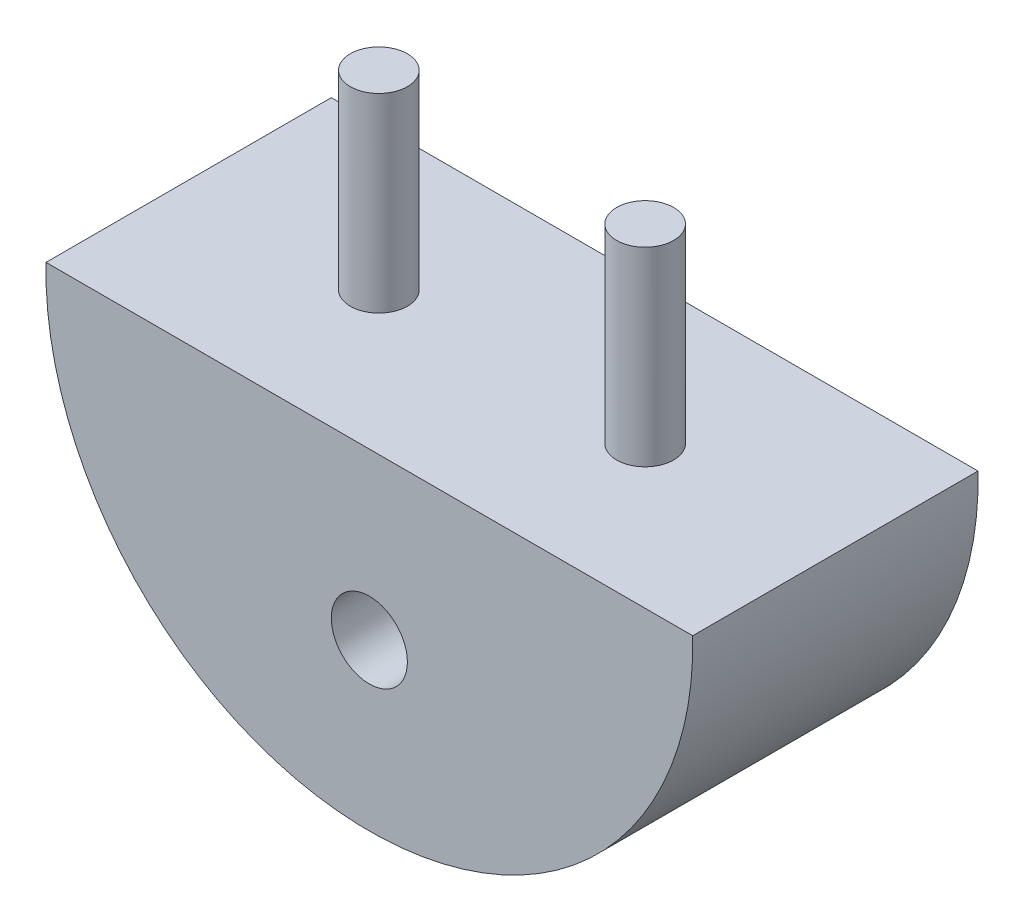
ISO-10303-21;
HEADER;
FILE_DESCRIPTION(('STEP AP214'),'2;1');
FILE_NAME('part.step','',(''),(''),'','','');
FILE_SCHEMA(('AUTOMOTIVE_DESIGN { 1 0 10303 214 1 1 1 1 }'));
ENDSEC;
DATA;
#1=APPLICATION_CONTEXT('core data for automotive mechanical design processes');
#2=APPLICATION_PROTOCOL_DEFINITION('international standard','automotive_design',2000,#1);
#3=PRODUCT_CONTEXT('',#1,'mechanical');
#4=PRODUCT('Part','Part','',(#3));
#5=PRODUCT_RELATED_PRODUCT_CATEGORY('part','',(#4));
#6=PRODUCT_DEFINITION_FORMATION('','',#4);
#7=PRODUCT_DEFINITION_CONTEXT('part definition',#1,'design');
#8=PRODUCT_DEFINITION('design','',#6,#7);
#9=PRODUCT_DEFINITION_SHAPE('','',#8);
#10=(LENGTH_UNIT() NAMED_UNIT(*) SI_UNIT(.MILLI.,.METRE.));
#11=(NAMED_UNIT(*) PLANE_ANGLE_UNIT() SI_UNIT($,.RADIAN.));
#12=(NAMED_UNIT(*) SI_UNIT($,.STERADIAN.) SOLID_ANGLE_UNIT());
#13=UNCERTAINTY_MEASURE_WITH_UNIT(LENGTH_MEASURE(1.E-05),#10,'distance_accuracy_value','');
#14=(GEOMETRIC_REPRESENTATION_CONTEXT(3) GLOBAL_UNCERTAINTY_ASSIGNED_CONTEXT((#13)) GLOBAL_UNIT_ASSIGNED_CONTEXT((#10,
#11,#12)) REPRESENTATION_CONTEXT('',''));
#15=CARTESIAN_POINT('',(0.,0.,0.));
#16=DIRECTION('',(0.,0.,1.));
#17=DIRECTION('',(1.,0.,0.));
#18=AXIS2_PLACEMENT_3D('',#15,#16,#17);
#19=CARTESIAN_POINT('',(0.668887469853108,5.92742394295285,15.));
#20=DIRECTION('',(0.,0.,1.));
#21=DIRECTION('',(1.,0.,0.));
#22=AXIS2_PLACEMENT_3D('',#19,#20,#21);
#23=PLANE('',#22);
#24=CARTESIAN_POINT('',(0.668887469853108,5.92742394295285,15.));
#25=DIRECTION('',(0.,0.,1.));
#26=DIRECTION('',(1.,0.,0.));
#27=AXIS2_PLACEMENT_3D('',#24,#25,#26);
#28=CIRCLE('',#27,17.0044917832215);
#29=CARTESIAN_POINT('',(-16.3311125301469,6.31824462516727,15.));
#30=VERTEX_POINT('',#29);
#31=CARTESIAN_POINT('',(17.6688874698531,6.31824462516727,15.));
#32=VERTEX_POINT('',#31);
#33=EDGE_CURVE('E67',#30,#32,#28,.T.);
#34=ORIENTED_EDGE('',*,*,#33,.T.);
#35=DIRECTION('',(-1.,0.,0.));
#36=VECTOR('',#35,1.);
#37=CARTESIAN_POINT('',(-16.3311125301469,6.31824462516727,15.));
#38=LINE('',#37,#36);
#39=EDGE_CURVE('E49',#32,#30,#38,.T.);
#40=ORIENTED_EDGE('',*,*,#39,.T.);
#41=EDGE_LOOP('',(#34,#40));
#42=FACE_BOUND('',#41,.T.);
#43=CARTESIAN_POINT('',(0.668887469853106,-2.37941160755068,15.));
#44=DIRECTION('',(0.,0.,1.));
#45=DIRECTION('',(1.,0.,0.));
#46=AXIS2_PLACEMENT_3D('',#43,#44,#45);
#47=CIRCLE('',#46,2.);
#48=CARTESIAN_POINT('',(2.66888746985311,-2.37941160755068,15.));
#49=VERTEX_POINT('',#48);
#50=EDGE_CURVE('E74',#49,#49,#47,.T.);
#51=ORIENTED_EDGE('',*,*,#50,.F.);
#52=EDGE_LOOP('',(#51));
#53=FACE_BOUND('',#52,.T.);
#54=ADVANCED_FACE('F33',(#42,#53),#23,.T.);
#55=CARTESIAN_POINT('',(0.668887469853108,5.92742394295285,0.));
#56=DIRECTION('',(0.,0.,1.));
#57=DIRECTION('',(1.,0.,0.));
#58=AXIS2_PLACEMENT_3D('',#55,#56,#57);
#59=PLANE('',#58);
#60=CARTESIAN_POINT('',(0.668887469853108,5.92742394295285,0.));
#61=DIRECTION('',(0.,0.,1.));
#62=DIRECTION('',(1.,0.,0.));
#63=AXIS2_PLACEMENT_3D('',#60,#61,#62);
#64=CIRCLE('',#63,17.0044917832215);
#65=CARTESIAN_POINT('',(-16.3311125301469,6.31824462516727,0.));
#66=VERTEX_POINT('',#65);
#67=CARTESIAN_POINT('',(17.6688874698531,6.31824462516727,0.));
#68=VERTEX_POINT('',#67);
#69=EDGE_CURVE('E68',#66,#68,#64,.T.);
#70=ORIENTED_EDGE('',*,*,#69,.F.);
#71=DIRECTION('',(-1.,0.,0.));
#72=VECTOR('',#71,1.);
#73=CARTESIAN_POINT('',(-16.3311125301469,6.31824462516727,0.));
#74=LINE('',#73,#72);
#75=EDGE_CURVE('E57',#68,#66,#74,.T.);
#76=ORIENTED_EDGE('',*,*,#75,.F.);
#77=EDGE_LOOP('',(#70,#76));
#78=FACE_BOUND('',#77,.T.);
#79=CARTESIAN_POINT('',(0.668887469853106,-2.37941160755068,0.));
#80=DIRECTION('',(0.,0.,1.));
#81=DIRECTION('',(1.,0.,0.));
#82=AXIS2_PLACEMENT_3D('',#79,#80,#81);
#83=CIRCLE('',#82,2.);
#84=CARTESIAN_POINT('',(2.66888746985311,-2.37941160755068,0.));
#85=VERTEX_POINT('',#84);
#86=EDGE_CURVE('E77',#85,#85,#83,.T.);
#87=ORIENTED_EDGE('',*,*,#86,.T.);
#88=EDGE_LOOP('',(#87));
#89=FACE_BOUND('',#88,.T.);
#90=ADVANCED_FACE('F72',(#78,#89),#59,.F.);
#91=CARTESIAN_POINT('',(0.668887469853108,5.92742394295285,15.));
#92=DIRECTION('',(0.,0.,-1.));
#93=DIRECTION('',(-1.,0.,0.));
#94=AXIS2_PLACEMENT_3D('',#91,#92,#93);
#95=CYLINDRICAL_SURFACE('',#94,17.0044917832215);
#96=ORIENTED_EDGE('',*,*,#69,.T.);
#97=DIRECTION('',(0.,0.,-1.));
#98=VECTOR('',#97,1.);
#99=CARTESIAN_POINT('',(17.6688874698531,6.31824462516727,15.));
#100=LINE('',#99,#98);
#101=EDGE_CURVE('E65',#32,#68,#100,.T.);
#102=ORIENTED_EDGE('',*,*,#101,.F.);
#103=ORIENTED_EDGE('',*,*,#33,.F.);
#104=DIRECTION('',(0.,0.,-1.));
#105=VECTOR('',#104,1.);
#106=CARTESIAN_POINT('',(-16.3311125301469,6.31824462516727,15.));
#107=LINE('',#106,#105);
#108=EDGE_CURVE('E62',#30,#66,#107,.T.);
#109=ORIENTED_EDGE('',*,*,#108,.T.);
#110=EDGE_LOOP('',(#96,#102,#103,#109));
#111=FACE_BOUND('',#110,.T.);
#112=ADVANCED_FACE('F35',(#111),#95,.T.);
#113=CARTESIAN_POINT('',(-16.3311125301469,6.31824462516727,15.));
#114=DIRECTION('',(0.,-1.,0.));
#115=DIRECTION('',(0.,0.,-1.));
#116=AXIS2_PLACEMENT_3D('',#113,#114,#115);
#117=PLANE('',#116);
#118=CARTESIAN_POINT('',(7.66888746985311,6.31824462516727,7.5));
#119=DIRECTION('',(0.,-1.,0.));
#120=DIRECTION('',(0.,0.,-1.));
#121=AXIS2_PLACEMENT_3D('',#118,#119,#120);
#122=CIRCLE('',#121,1.5);
#123=CARTESIAN_POINT('',(7.66888746985311,6.31824462516727,6.));
#124=VERTEX_POINT('',#123);
#125=EDGE_CURVE('E11',#124,#124,#122,.F.);
#126=ORIENTED_EDGE('',*,*,#125,.F.);
#127=EDGE_LOOP('',(#126));
#128=FACE_BOUND('',#127,.T.);
#129=CARTESIAN_POINT('',(-6.33111253014689,6.31824462516727,7.5));
#130=DIRECTION('',(0.,-1.,0.));
#131=DIRECTION('',(0.,0.,-1.));
#132=AXIS2_PLACEMENT_3D('',#129,#130,#131);
#133=CIRCLE('',#132,1.5);
#134=CARTESIAN_POINT('',(-6.33111253014689,6.31824462516727,6.));
#135=VERTEX_POINT('',#134);
#136=EDGE_CURVE('E42',#135,#135,#133,.F.);
#137=ORIENTED_EDGE('',*,*,#136,.F.);
#138=EDGE_LOOP('',(#137));
#139=FACE_BOUND('',#138,.T.);
#140=ORIENTED_EDGE('',*,*,#75,.T.);
#141=ORIENTED_EDGE('',*,*,#108,.F.);
#142=ORIENTED_EDGE('',*,*,#39,.F.);
#143=ORIENTED_EDGE('',*,*,#101,.T.);
#144=EDGE_LOOP('',(#140,#141,#142,#143));
#145=FACE_BOUND('',#144,.T.);
#146=ADVANCED_FACE('F61',(#128,#139,#145),#117,.F.);
#147=CARTESIAN_POINT('',(0.668887469853106,-2.37941160755068,15.));
#148=DIRECTION('',(0.,0.,-1.));
#149=DIRECTION('',(-1.,0.,0.));
#150=AXIS2_PLACEMENT_3D('',#147,#148,#149);
#151=CYLINDRICAL_SURFACE('',#150,2.);
#152=ORIENTED_EDGE('',*,*,#50,.T.);
#153=EDGE_LOOP('',(#152));
#154=FACE_BOUND('',#153,.T.);
#155=ORIENTED_EDGE('',*,*,#86,.F.);
#156=EDGE_LOOP('',(#155));
#157=FACE_BOUND('',#156,.T.);
#158=ADVANCED_FACE('F88',(#154,#157),#151,.F.);
#159=CARTESIAN_POINT('',(-6.33111253014689,16.3182446251673,7.5));
#160=DIRECTION('',(0.,-1.,0.));
#161=DIRECTION('',(0.,0.,-1.));
#162=AXIS2_PLACEMENT_3D('',#159,#160,#161);
#163=CYLINDRICAL_SURFACE('',#162,1.5);
#164=CARTESIAN_POINT('',(-6.33111253014689,16.3182446251673,7.5));
#165=DIRECTION('',(0.,1.,0.));
#166=DIRECTION('',(0.,0.,1.));
#167=AXIS2_PLACEMENT_3D('',#164,#165,#166);
#168=CIRCLE('',#167,1.5);
#169=CARTESIAN_POINT('',(-6.33111253014689,16.3182446251673,9.));
#170=VERTEX_POINT('',#169);
#171=EDGE_CURVE('E124',#170,#170,#168,.T.);
#172=ORIENTED_EDGE('',*,*,#171,.F.);
#173=EDGE_LOOP('',(#172));
#174=FACE_BOUND('',#173,.T.);
#175=ORIENTED_EDGE('',*,*,#136,.T.);
#176=EDGE_LOOP('',(#175));
#177=FACE_BOUND('',#176,.T.);
#178=ADVANCED_FACE('F85',(#174,#177),#163,.T.);
#179=CARTESIAN_POINT('',(-6.33111253014689,16.3182446251673,7.5));
#180=DIRECTION('',(0.,1.,0.));
#181=DIRECTION('',(0.,0.,1.));
#182=AXIS2_PLACEMENT_3D('',#179,#180,#181);
#183=PLANE('',#182);
#184=ORIENTED_EDGE('',*,*,#171,.T.);
#185=EDGE_LOOP('',(#184));
#186=FACE_BOUND('',#185,.T.);
#187=ADVANCED_FACE('F107',(#186),#183,.T.);
#188=CARTESIAN_POINT('',(7.66888746985311,16.3182446251673,7.5));
#189=DIRECTION('',(0.,-1.,0.));
#190=DIRECTION('',(0.,0.,-1.));
#191=AXIS2_PLACEMENT_3D('',#188,#189,#190);
#192=CYLINDRICAL_SURFACE('',#191,1.5);
#193=CARTESIAN_POINT('',(7.66888746985311,16.3182446251673,7.5));
#194=DIRECTION('',(0.,1.,0.));
#195=DIRECTION('',(0.,0.,1.));
#196=AXIS2_PLACEMENT_3D('',#193,#194,#195);
#197=CIRCLE('',#196,1.5);
#198=CARTESIAN_POINT('',(7.66888746985311,16.3182446251673,9.));
#199=VERTEX_POINT('',#198);
#200=EDGE_CURVE('E123',#199,#199,#197,.T.);
#201=ORIENTED_EDGE('',*,*,#200,.F.);
#202=EDGE_LOOP('',(#201));
#203=FACE_BOUND('',#202,.T.);
#204=ORIENTED_EDGE('',*,*,#125,.T.);
#205=EDGE_LOOP('',(#204));
#206=FACE_BOUND('',#205,.T.);
#207=ADVANCED_FACE('F111',(#203,#206),#192,.T.);
#208=CARTESIAN_POINT('',(7.66888746985311,16.3182446251673,7.5));
#209=DIRECTION('',(0.,1.,0.));
#210=DIRECTION('',(0.,0.,1.));
#211=AXIS2_PLACEMENT_3D('',#208,#209,#210);
#212=PLANE('',#211);
#213=ORIENTED_EDGE('',*,*,#200,.T.);
#214=EDGE_LOOP('',(#213));
#215=FACE_BOUND('',#214,.T.);
#216=ADVANCED_FACE('F115',(#215),#212,.T.);
#217=CLOSED_SHELL('',(#54,#90,#112,#146,#158,#178,#187,#207,#216));
#218=MANIFOLD_SOLID_BREP('B2',#217);
#219=ADVANCED_BREP_SHAPE_REPRESENTATION('',(#18,#218),#14);
#220=SHAPE_DEFINITION_REPRESENTATION(#9,#219);
ENDSEC;
END-ISO-10303-21;
